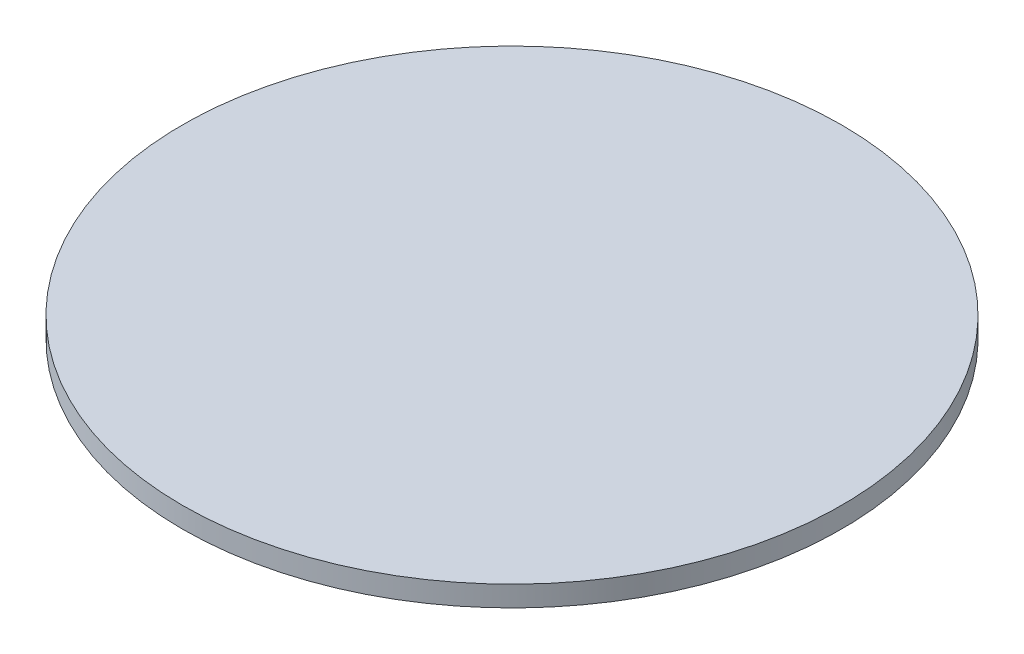
ISO-10303-21;
HEADER;
FILE_DESCRIPTION(('STEP AP214'),'2;1');
FILE_NAME('part.step','',(''),(''),'','','');
FILE_SCHEMA(('AUTOMOTIVE_DESIGN { 1 0 10303 214 1 1 1 1 }'));
ENDSEC;
DATA;
#1=APPLICATION_CONTEXT('core data for automotive mechanical design processes');
#2=APPLICATION_PROTOCOL_DEFINITION('international standard','automotive_design',2000,#1);
#3=PRODUCT_CONTEXT('',#1,'mechanical');
#4=PRODUCT('Part','Part','',(#3));
#5=PRODUCT_RELATED_PRODUCT_CATEGORY('part','',(#4));
#6=PRODUCT_DEFINITION_FORMATION('','',#4);
#7=PRODUCT_DEFINITION_CONTEXT('part definition',#1,'design');
#8=PRODUCT_DEFINITION('design','',#6,#7);
#9=PRODUCT_DEFINITION_SHAPE('','',#8);
#10=(LENGTH_UNIT() NAMED_UNIT(*) SI_UNIT(.MILLI.,.METRE.));
#11=(NAMED_UNIT(*) PLANE_ANGLE_UNIT() SI_UNIT($,.RADIAN.));
#12=(NAMED_UNIT(*) SI_UNIT($,.STERADIAN.) SOLID_ANGLE_UNIT());
#13=UNCERTAINTY_MEASURE_WITH_UNIT(LENGTH_MEASURE(1.E-05),#10,'distance_accuracy_value','');
#14=(GEOMETRIC_REPRESENTATION_CONTEXT(3) GLOBAL_UNCERTAINTY_ASSIGNED_CONTEXT((#13)) GLOBAL_UNIT_ASSIGNED_CONTEXT((#10,
#11,#12)) REPRESENTATION_CONTEXT('',''));
#15=CARTESIAN_POINT('',(0.,0.,0.));
#16=DIRECTION('',(0.,0.,1.));
#17=DIRECTION('',(1.,0.,0.));
#18=AXIS2_PLACEMENT_3D('',#15,#16,#17);
#19=CARTESIAN_POINT('',(0.,1.,0.));
#20=DIRECTION('',(0.,-1.,0.));
#21=DIRECTION('',(0.,0.,-1.));
#22=AXIS2_PLACEMENT_3D('',#19,#20,#21);
#23=CYLINDRICAL_SURFACE('',#22,16.);
#24=CARTESIAN_POINT('',(0.,1.,0.));
#25=DIRECTION('',(0.,1.,0.));
#26=DIRECTION('',(0.,0.,1.));
#27=AXIS2_PLACEMENT_3D('',#24,#25,#26);
#28=CIRCLE('',#27,16.);
#29=CARTESIAN_POINT('',(0.,1.,16.));
#30=VERTEX_POINT('',#29);
#31=EDGE_CURVE('E11',#30,#30,#28,.T.);
#32=ORIENTED_EDGE('',*,*,#31,.F.);
#33=EDGE_LOOP('',(#32));
#34=FACE_BOUND('',#33,.T.);
#35=CARTESIAN_POINT('',(0.,0.,0.));
#36=DIRECTION('',(0.,1.,0.));
#37=DIRECTION('',(0.,0.,1.));
#38=AXIS2_PLACEMENT_3D('',#35,#36,#37);
#39=CIRCLE('',#38,16.);
#40=CARTESIAN_POINT('',(0.,0.,16.));
#41=VERTEX_POINT('',#40);
#42=EDGE_CURVE('E40',#41,#41,#39,.T.);
#43=ORIENTED_EDGE('',*,*,#42,.T.);
#44=EDGE_LOOP('',(#43));
#45=FACE_BOUND('',#44,.T.);
#46=ADVANCED_FACE('F37',(#34,#45),#23,.T.);
#47=CARTESIAN_POINT('',(0.,0.,0.));
#48=DIRECTION('',(0.,1.,0.));
#49=DIRECTION('',(0.,0.,1.));
#50=AXIS2_PLACEMENT_3D('',#47,#48,#49);
#51=PLANE('',#50);
#52=ORIENTED_EDGE('',*,*,#42,.F.);
#53=EDGE_LOOP('',(#52));
#54=FACE_BOUND('',#53,.T.);
#55=ADVANCED_FACE('F50',(#54),#51,.F.);
#56=CARTESIAN_POINT('',(0.,1.,0.));
#57=DIRECTION('',(0.,1.,0.));
#58=DIRECTION('',(0.,0.,1.));
#59=AXIS2_PLACEMENT_3D('',#56,#57,#58);
#60=PLANE('',#59);
#61=ORIENTED_EDGE('',*,*,#31,.T.);
#62=EDGE_LOOP('',(#61));
#63=FACE_BOUND('',#62,.T.);
#64=ADVANCED_FACE('F52',(#63),#60,.T.);
#65=CLOSED_SHELL('',(#46,#55,#64));
#66=MANIFOLD_SOLID_BREP('B2',#65);
#67=ADVANCED_BREP_SHAPE_REPRESENTATION('',(#18,#66),#14);
#68=SHAPE_DEFINITION_REPRESENTATION(#9,#67);
ENDSEC;
END-ISO-10303-21;
